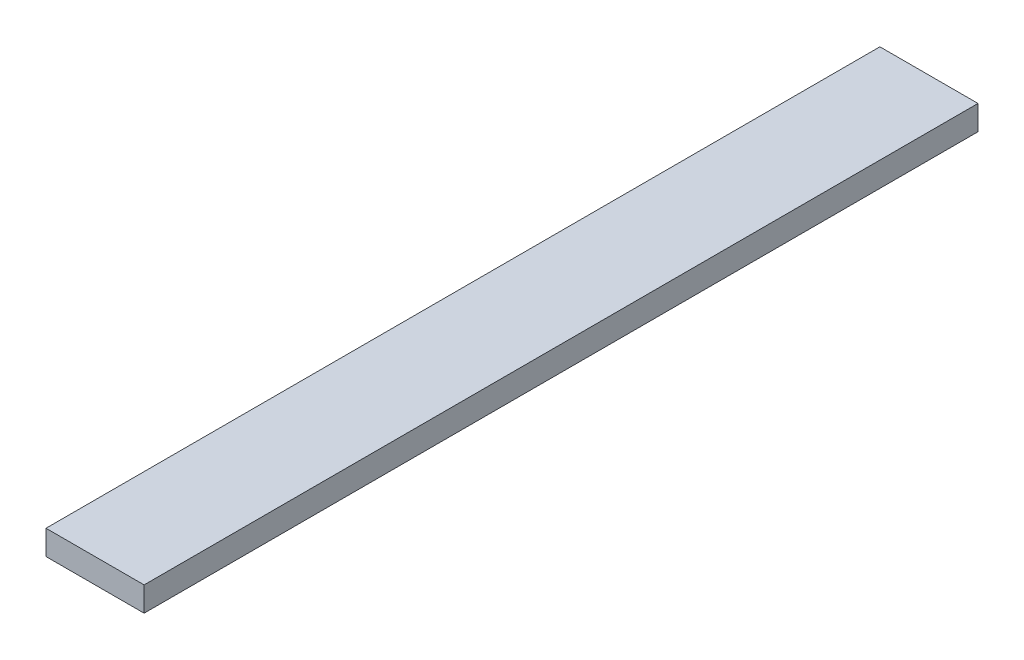
ISO-10303-21;
HEADER;
FILE_DESCRIPTION(('STEP AP214'),'2;1');
FILE_NAME('part.step','',(''),(''),'','','');
FILE_SCHEMA(('AUTOMOTIVE_DESIGN { 1 0 10303 214 1 1 1 1 }'));
ENDSEC;
DATA;
#1=APPLICATION_CONTEXT('core data for automotive mechanical design processes');
#2=APPLICATION_PROTOCOL_DEFINITION('international standard','automotive_design',2000,#1);
#3=PRODUCT_CONTEXT('',#1,'mechanical');
#4=PRODUCT('Part','Part','',(#3));
#5=PRODUCT_RELATED_PRODUCT_CATEGORY('part','',(#4));
#6=PRODUCT_DEFINITION_FORMATION('','',#4);
#7=PRODUCT_DEFINITION_CONTEXT('part definition',#1,'design');
#8=PRODUCT_DEFINITION('design','',#6,#7);
#9=PRODUCT_DEFINITION_SHAPE('','',#8);
#10=(LENGTH_UNIT() NAMED_UNIT(*) SI_UNIT(.MILLI.,.METRE.));
#11=(NAMED_UNIT(*) PLANE_ANGLE_UNIT() SI_UNIT($,.RADIAN.));
#12=(NAMED_UNIT(*) SI_UNIT($,.STERADIAN.) SOLID_ANGLE_UNIT());
#13=UNCERTAINTY_MEASURE_WITH_UNIT(LENGTH_MEASURE(1.E-05),#10,'distance_accuracy_value','');
#14=(GEOMETRIC_REPRESENTATION_CONTEXT(3) GLOBAL_UNCERTAINTY_ASSIGNED_CONTEXT((#13)) GLOBAL_UNIT_ASSIGNED_CONTEXT((#10,
#11,#12)) REPRESENTATION_CONTEXT('',''));
#15=CARTESIAN_POINT('',(0.,0.,0.));
#16=DIRECTION('',(0.,0.,1.));
#17=DIRECTION('',(1.,0.,0.));
#18=AXIS2_PLACEMENT_3D('',#15,#16,#17);
#19=CARTESIAN_POINT('',(10.,5.,85.));
#20=DIRECTION('',(-1.,0.,0.));
#21=DIRECTION('',(0.,0.,1.));
#22=AXIS2_PLACEMENT_3D('',#19,#20,#21);
#23=PLANE('',#22);
#24=DIRECTION('',(0.,0.,-1.));
#25=VECTOR('',#24,1.);
#26=CARTESIAN_POINT('',(10.,0.,85.));
#27=LINE('',#26,#25);
#28=CARTESIAN_POINT('',(10.,0.,85.));
#29=VERTEX_POINT('',#28);
#30=CARTESIAN_POINT('',(10.,0.,-85.));
#31=VERTEX_POINT('',#30);
#32=EDGE_CURVE('E113',#29,#31,#27,.T.);
#33=ORIENTED_EDGE('',*,*,#32,.T.);
#34=DIRECTION('',(0.,-1.,0.));
#35=VECTOR('',#34,1.);
#36=CARTESIAN_POINT('',(10.,5.,-85.));
#37=LINE('',#36,#35);
#38=CARTESIAN_POINT('',(10.,5.,-85.));
#39=VERTEX_POINT('',#38);
#40=EDGE_CURVE('E11',#39,#31,#37,.T.);
#41=ORIENTED_EDGE('',*,*,#40,.F.);
#42=DIRECTION('',(0.,0.,-1.));
#43=VECTOR('',#42,1.);
#44=CARTESIAN_POINT('',(10.,5.,85.));
#45=LINE('',#44,#43);
#46=CARTESIAN_POINT('',(10.,5.,85.));
#47=VERTEX_POINT('',#46);
#48=EDGE_CURVE('E97',#47,#39,#45,.T.);
#49=ORIENTED_EDGE('',*,*,#48,.F.);
#50=DIRECTION('',(0.,-1.,0.));
#51=VECTOR('',#50,1.);
#52=CARTESIAN_POINT('',(10.,5.,85.));
#53=LINE('',#52,#51);
#54=EDGE_CURVE('E109',#47,#29,#53,.T.);
#55=ORIENTED_EDGE('',*,*,#54,.T.);
#56=EDGE_LOOP('',(#33,#41,#49,#55));
#57=FACE_BOUND('',#56,.T.);
#58=ADVANCED_FACE('F45',(#57),#23,.F.);
#59=CARTESIAN_POINT('',(-10.,5.,-85.));
#60=DIRECTION('',(0.,0.,1.));
#61=DIRECTION('',(1.,0.,0.));
#62=AXIS2_PLACEMENT_3D('',#59,#60,#61);
#63=PLANE('',#62);
#64=DIRECTION('',(-1.,0.,0.));
#65=VECTOR('',#64,1.);
#66=CARTESIAN_POINT('',(-10.,0.,-85.));
#67=LINE('',#66,#65);
#68=CARTESIAN_POINT('',(-10.,0.,-85.));
#69=VERTEX_POINT('',#68);
#70=EDGE_CURVE('E102',#31,#69,#67,.T.);
#71=ORIENTED_EDGE('',*,*,#70,.T.);
#72=DIRECTION('',(0.,-1.,0.));
#73=VECTOR('',#72,1.);
#74=CARTESIAN_POINT('',(-10.,5.,-85.));
#75=LINE('',#74,#73);
#76=CARTESIAN_POINT('',(-10.,5.,-85.));
#77=VERTEX_POINT('',#76);
#78=EDGE_CURVE('E54',#77,#69,#75,.T.);
#79=ORIENTED_EDGE('',*,*,#78,.F.);
#80=DIRECTION('',(-1.,0.,0.));
#81=VECTOR('',#80,1.);
#82=CARTESIAN_POINT('',(-10.,5.,-85.));
#83=LINE('',#82,#81);
#84=EDGE_CURVE('E92',#39,#77,#83,.T.);
#85=ORIENTED_EDGE('',*,*,#84,.F.);
#86=ORIENTED_EDGE('',*,*,#40,.T.);
#87=EDGE_LOOP('',(#71,#79,#85,#86));
#88=FACE_BOUND('',#87,.T.);
#89=ADVANCED_FACE('F101',(#88),#63,.F.);
#90=CARTESIAN_POINT('',(-9.99999999999998,5.,85.));
#91=DIRECTION('',(1.,0.,0.));
#92=DIRECTION('',(0.,0.,-1.));
#93=AXIS2_PLACEMENT_3D('',#90,#91,#92);
#94=PLANE('',#93);
#95=DIRECTION('',(0.,0.,1.));
#96=VECTOR('',#95,1.);
#97=CARTESIAN_POINT('',(-9.99999999999998,0.,85.));
#98=LINE('',#97,#96);
#99=CARTESIAN_POINT('',(-9.99999999999998,0.,85.));
#100=VERTEX_POINT('',#99);
#101=EDGE_CURVE('E79',#69,#100,#98,.T.);
#102=ORIENTED_EDGE('',*,*,#101,.T.);
#103=DIRECTION('',(0.,-1.,0.));
#104=VECTOR('',#103,1.);
#105=CARTESIAN_POINT('',(-9.99999999999998,5.,85.));
#106=LINE('',#105,#104);
#107=CARTESIAN_POINT('',(-9.99999999999998,5.,85.));
#108=VERTEX_POINT('',#107);
#109=EDGE_CURVE('E104',#108,#100,#106,.T.);
#110=ORIENTED_EDGE('',*,*,#109,.F.);
#111=DIRECTION('',(0.,0.,1.));
#112=VECTOR('',#111,1.);
#113=CARTESIAN_POINT('',(-9.99999999999998,5.,85.));
#114=LINE('',#113,#112);
#115=EDGE_CURVE('E95',#77,#108,#114,.T.);
#116=ORIENTED_EDGE('',*,*,#115,.F.);
#117=ORIENTED_EDGE('',*,*,#78,.T.);
#118=EDGE_LOOP('',(#102,#110,#116,#117));
#119=FACE_BOUND('',#118,.T.);
#120=ADVANCED_FACE('F105',(#119),#94,.F.);
#121=CARTESIAN_POINT('',(-9.99999999999998,5.,85.));
#122=DIRECTION('',(0.,0.,-1.));
#123=DIRECTION('',(-1.,0.,0.));
#124=AXIS2_PLACEMENT_3D('',#121,#122,#123);
#125=PLANE('',#124);
#126=DIRECTION('',(1.,0.,0.));
#127=VECTOR('',#126,1.);
#128=CARTESIAN_POINT('',(-9.99999999999998,0.,85.));
#129=LINE('',#128,#127);
#130=EDGE_CURVE('E85',#100,#29,#129,.T.);
#131=ORIENTED_EDGE('',*,*,#130,.T.);
#132=ORIENTED_EDGE('',*,*,#54,.F.);
#133=DIRECTION('',(1.,0.,0.));
#134=VECTOR('',#133,1.);
#135=CARTESIAN_POINT('',(-9.99999999999998,5.,85.));
#136=LINE('',#135,#134);
#137=EDGE_CURVE('E62',#108,#47,#136,.T.);
#138=ORIENTED_EDGE('',*,*,#137,.F.);
#139=ORIENTED_EDGE('',*,*,#109,.T.);
#140=EDGE_LOOP('',(#131,#132,#138,#139));
#141=FACE_BOUND('',#140,.T.);
#142=ADVANCED_FACE('F126',(#141),#125,.F.);
#143=CARTESIAN_POINT('',(0.,5.,0.));
#144=DIRECTION('',(0.,-1.,0.));
#145=DIRECTION('',(0.,0.,-1.));
#146=AXIS2_PLACEMENT_3D('',#143,#144,#145);
#147=PLANE('',#146);
#148=ORIENTED_EDGE('',*,*,#48,.T.);
#149=ORIENTED_EDGE('',*,*,#84,.T.);
#150=ORIENTED_EDGE('',*,*,#115,.T.);
#151=ORIENTED_EDGE('',*,*,#137,.T.);
#152=EDGE_LOOP('',(#148,#149,#150,#151));
#153=FACE_BOUND('',#152,.T.);
#154=ADVANCED_FACE('F93',(#153),#147,.F.);
#155=CARTESIAN_POINT('',(0.,0.,0.));
#156=DIRECTION('',(0.,-1.,0.));
#157=DIRECTION('',(0.,0.,-1.));
#158=AXIS2_PLACEMENT_3D('',#155,#156,#157);
#159=PLANE('',#158);
#160=ORIENTED_EDGE('',*,*,#32,.F.);
#161=ORIENTED_EDGE('',*,*,#130,.F.);
#162=ORIENTED_EDGE('',*,*,#101,.F.);
#163=ORIENTED_EDGE('',*,*,#70,.F.);
#164=EDGE_LOOP('',(#160,#161,#162,#163));
#165=FACE_BOUND('',#164,.T.);
#166=ADVANCED_FACE('F129',(#165),#159,.T.);
#167=CLOSED_SHELL('',(#58,#89,#120,#142,#154,#166));
#168=MANIFOLD_SOLID_BREP('B2',#167);
#169=ADVANCED_BREP_SHAPE_REPRESENTATION('',(#18,#168),#14);
#170=SHAPE_DEFINITION_REPRESENTATION(#9,#169);
ENDSEC;
END-ISO-10303-21;
